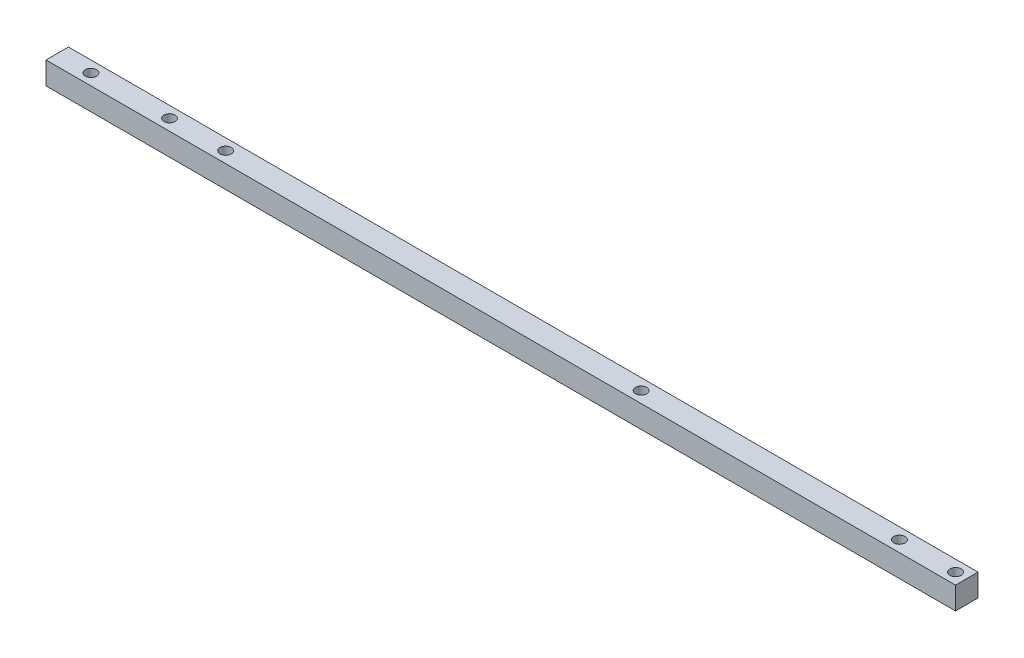
ISO-10303-21;
HEADER;
FILE_DESCRIPTION(('STEP AP214'),'2;1');
FILE_NAME('part.step','',(''),(''),'','','');
FILE_SCHEMA(('AUTOMOTIVE_DESIGN { 1 0 10303 214 1 1 1 1 }'));
ENDSEC;
DATA;
#1=APPLICATION_CONTEXT('core data for automotive mechanical design processes');
#2=APPLICATION_PROTOCOL_DEFINITION('international standard','automotive_design',2000,#1);
#3=PRODUCT_CONTEXT('',#1,'mechanical');
#4=PRODUCT('Part','Part','',(#3));
#5=PRODUCT_RELATED_PRODUCT_CATEGORY('part','',(#4));
#6=PRODUCT_DEFINITION_FORMATION('','',#4);
#7=PRODUCT_DEFINITION_CONTEXT('part definition',#1,'design');
#8=PRODUCT_DEFINITION('design','',#6,#7);
#9=PRODUCT_DEFINITION_SHAPE('','',#8);
#10=(LENGTH_UNIT() NAMED_UNIT(*) SI_UNIT(.MILLI.,.METRE.));
#11=(NAMED_UNIT(*) PLANE_ANGLE_UNIT() SI_UNIT($,.RADIAN.));
#12=(NAMED_UNIT(*) SI_UNIT($,.STERADIAN.) SOLID_ANGLE_UNIT());
#13=UNCERTAINTY_MEASURE_WITH_UNIT(LENGTH_MEASURE(1.E-05),#10,'distance_accuracy_value','');
#14=(GEOMETRIC_REPRESENTATION_CONTEXT(3) GLOBAL_UNCERTAINTY_ASSIGNED_CONTEXT((#13)) GLOBAL_UNIT_ASSIGNED_CONTEXT((#10,
#11,#12)) REPRESENTATION_CONTEXT('',''));
#15=CARTESIAN_POINT('',(0.,0.,0.));
#16=DIRECTION('',(0.,0.,1.));
#17=DIRECTION('',(1.,0.,0.));
#18=AXIS2_PLACEMENT_3D('',#15,#16,#17);
#19=CARTESIAN_POINT('',(0.,6.35,0.));
#20=DIRECTION('',(0.,-1.,0.));
#21=DIRECTION('',(0.,0.,-1.));
#22=AXIS2_PLACEMENT_3D('',#19,#20,#21);
#23=PLANE('',#22);
#24=DIRECTION('',(0.,0.,1.));
#25=VECTOR('',#24,1.);
#26=CARTESIAN_POINT('',(0.,6.35,0.));
#27=LINE('',#26,#25);
#28=CARTESIAN_POINT('',(0.,6.35,-6.35));
#29=VERTEX_POINT('',#28);
#30=CARTESIAN_POINT('',(0.,6.35,0.));
#31=VERTEX_POINT('',#30);
#32=EDGE_CURVE('E93',#29,#31,#27,.T.);
#33=ORIENTED_EDGE('',*,*,#32,.T.);
#34=DIRECTION('',(1.,0.,0.));
#35=VECTOR('',#34,1.);
#36=CARTESIAN_POINT('',(0.,6.35,0.));
#37=LINE('',#36,#35);
#38=CARTESIAN_POINT('',(257.175,6.35,0.));
#39=VERTEX_POINT('',#38);
#40=EDGE_CURVE('E88',#31,#39,#37,.T.);
#41=ORIENTED_EDGE('',*,*,#40,.T.);
#42=DIRECTION('',(0.,0.,-1.));
#43=VECTOR('',#42,1.);
#44=CARTESIAN_POINT('',(257.175,6.35,0.));
#45=LINE('',#44,#43);
#46=CARTESIAN_POINT('',(257.175,6.35,-6.35));
#47=VERTEX_POINT('',#46);
#48=EDGE_CURVE('E90',#39,#47,#45,.T.);
#49=ORIENTED_EDGE('',*,*,#48,.T.);
#50=DIRECTION('',(-1.,0.,0.));
#51=VECTOR('',#50,1.);
#52=CARTESIAN_POINT('',(0.,6.35,-6.35));
#53=LINE('',#52,#51);
#54=EDGE_CURVE('E57',#47,#29,#53,.T.);
#55=ORIENTED_EDGE('',*,*,#54,.T.);
#56=EDGE_LOOP('',(#33,#41,#49,#55));
#57=FACE_BOUND('',#56,.T.);
#58=CARTESIAN_POINT('',(31.75,6.35,-3.175));
#59=DIRECTION('',(0.,1.,0.));
#60=DIRECTION('',(0.,0.,1.));
#61=AXIS2_PLACEMENT_3D('',#58,#59,#60);
#62=CIRCLE('',#61,1.5875);
#63=CARTESIAN_POINT('',(31.75,6.35,-1.5875));
#64=VERTEX_POINT('',#63);
#65=EDGE_CURVE('E106',#64,#64,#62,.T.);
#66=ORIENTED_EDGE('',*,*,#65,.F.);
#67=EDGE_LOOP('',(#66));
#68=FACE_BOUND('',#67,.T.);
#69=CARTESIAN_POINT('',(165.1,6.35,-3.175));
#70=DIRECTION('',(0.,1.,0.));
#71=DIRECTION('',(0.,0.,1.));
#72=AXIS2_PLACEMENT_3D('',#69,#70,#71);
#73=CIRCLE('',#72,1.58749999999999);
#74=CARTESIAN_POINT('',(165.1,6.35,-1.58750000000001));
#75=VERTEX_POINT('',#74);
#76=EDGE_CURVE('E123',#75,#75,#73,.T.);
#77=ORIENTED_EDGE('',*,*,#76,.F.);
#78=EDGE_LOOP('',(#77));
#79=FACE_BOUND('',#78,.T.);
#80=CARTESIAN_POINT('',(238.125,6.35,-3.175));
#81=DIRECTION('',(0.,1.,0.));
#82=DIRECTION('',(0.,0.,1.));
#83=AXIS2_PLACEMENT_3D('',#80,#81,#82);
#84=CIRCLE('',#83,1.58749999999999);
#85=CARTESIAN_POINT('',(238.125,6.35,-1.58750000000001));
#86=VERTEX_POINT('',#85);
#87=EDGE_CURVE('E130',#86,#86,#84,.T.);
#88=ORIENTED_EDGE('',*,*,#87,.F.);
#89=EDGE_LOOP('',(#88));
#90=FACE_BOUND('',#89,.T.);
#91=CARTESIAN_POINT('',(9.525,6.35,-3.175));
#92=DIRECTION('',(0.,1.,0.));
#93=DIRECTION('',(0.,0.,1.));
#94=AXIS2_PLACEMENT_3D('',#91,#92,#93);
#95=CIRCLE('',#94,1.5875);
#96=CARTESIAN_POINT('',(9.525,6.35,-1.5875));
#97=VERTEX_POINT('',#96);
#98=EDGE_CURVE('E134',#97,#97,#95,.T.);
#99=ORIENTED_EDGE('',*,*,#98,.F.);
#100=EDGE_LOOP('',(#99));
#101=FACE_BOUND('',#100,.T.);
#102=CARTESIAN_POINT('',(47.625,6.35,-3.175));
#103=DIRECTION('',(0.,1.,0.));
#104=DIRECTION('',(0.,0.,1.));
#105=AXIS2_PLACEMENT_3D('',#102,#103,#104);
#106=CIRCLE('',#105,1.5875);
#107=CARTESIAN_POINT('',(47.625,6.35,-1.5875));
#108=VERTEX_POINT('',#107);
#109=EDGE_CURVE('E140',#108,#108,#106,.T.);
#110=ORIENTED_EDGE('',*,*,#109,.F.);
#111=EDGE_LOOP('',(#110));
#112=FACE_BOUND('',#111,.T.);
#113=CARTESIAN_POINT('',(254.,6.35,-3.175));
#114=DIRECTION('',(0.,1.,0.));
#115=DIRECTION('',(0.,0.,1.));
#116=AXIS2_PLACEMENT_3D('',#113,#114,#115);
#117=CIRCLE('',#116,1.58750000000004);
#118=CARTESIAN_POINT('',(254.,6.35,-1.58749999999996));
#119=VERTEX_POINT('',#118);
#120=EDGE_CURVE('E144',#119,#119,#117,.T.);
#121=ORIENTED_EDGE('',*,*,#120,.F.);
#122=EDGE_LOOP('',(#121));
#123=FACE_BOUND('',#122,.T.);
#124=ADVANCED_FACE('F39',(#57,#68,#79,#90,#101,#112,#123),#23,.F.);
#125=CARTESIAN_POINT('',(0.,0.,0.));
#126=DIRECTION('',(0.,-1.,0.));
#127=DIRECTION('',(0.,0.,-1.));
#128=AXIS2_PLACEMENT_3D('',#125,#126,#127);
#129=PLANE('',#128);
#130=CARTESIAN_POINT('',(47.625,0.,-3.175));
#131=DIRECTION('',(0.,1.,0.));
#132=DIRECTION('',(0.,0.,1.));
#133=AXIS2_PLACEMENT_3D('',#130,#131,#132);
#134=CIRCLE('',#133,1.5875);
#135=CARTESIAN_POINT('',(47.625,0.,-1.5875));
#136=VERTEX_POINT('',#135);
#137=EDGE_CURVE('E142',#136,#136,#134,.T.);
#138=ORIENTED_EDGE('',*,*,#137,.T.);
#139=EDGE_LOOP('',(#138));
#140=FACE_BOUND('',#139,.T.);
#141=CARTESIAN_POINT('',(238.125,0.,-3.175));
#142=DIRECTION('',(0.,1.,0.));
#143=DIRECTION('',(0.,0.,1.));
#144=AXIS2_PLACEMENT_3D('',#141,#142,#143);
#145=CIRCLE('',#144,1.58749999999999);
#146=CARTESIAN_POINT('',(238.125,0.,-1.58750000000001));
#147=VERTEX_POINT('',#146);
#148=EDGE_CURVE('E128',#147,#147,#145,.T.);
#149=ORIENTED_EDGE('',*,*,#148,.T.);
#150=EDGE_LOOP('',(#149));
#151=FACE_BOUND('',#150,.T.);
#152=CARTESIAN_POINT('',(31.75,0.,-3.175));
#153=DIRECTION('',(0.,1.,0.));
#154=DIRECTION('',(0.,0.,1.));
#155=AXIS2_PLACEMENT_3D('',#152,#153,#154);
#156=CIRCLE('',#155,1.5875);
#157=CARTESIAN_POINT('',(31.75,0.,-1.5875));
#158=VERTEX_POINT('',#157);
#159=EDGE_CURVE('E119',#158,#158,#156,.T.);
#160=ORIENTED_EDGE('',*,*,#159,.T.);
#161=EDGE_LOOP('',(#160));
#162=FACE_BOUND('',#161,.T.);
#163=DIRECTION('',(0.,0.,1.));
#164=VECTOR('',#163,1.);
#165=CARTESIAN_POINT('',(0.,0.,0.));
#166=LINE('',#165,#164);
#167=CARTESIAN_POINT('',(0.,0.,-6.35));
#168=VERTEX_POINT('',#167);
#169=CARTESIAN_POINT('',(0.,0.,0.));
#170=VERTEX_POINT('',#169);
#171=EDGE_CURVE('E103',#168,#170,#166,.T.);
#172=ORIENTED_EDGE('',*,*,#171,.F.);
#173=DIRECTION('',(-1.,0.,0.));
#174=VECTOR('',#173,1.);
#175=CARTESIAN_POINT('',(0.,0.,-6.35));
#176=LINE('',#175,#174);
#177=CARTESIAN_POINT('',(257.175,0.,-6.35));
#178=VERTEX_POINT('',#177);
#179=EDGE_CURVE('E76',#178,#168,#176,.T.);
#180=ORIENTED_EDGE('',*,*,#179,.F.);
#181=DIRECTION('',(0.,0.,-1.));
#182=VECTOR('',#181,1.);
#183=CARTESIAN_POINT('',(257.175,0.,0.));
#184=LINE('',#183,#182);
#185=CARTESIAN_POINT('',(257.175,0.,0.));
#186=VERTEX_POINT('',#185);
#187=EDGE_CURVE('E71',#186,#178,#184,.T.);
#188=ORIENTED_EDGE('',*,*,#187,.F.);
#189=DIRECTION('',(1.,0.,0.));
#190=VECTOR('',#189,1.);
#191=CARTESIAN_POINT('',(0.,0.,0.));
#192=LINE('',#191,#190);
#193=EDGE_CURVE('E92',#170,#186,#192,.T.);
#194=ORIENTED_EDGE('',*,*,#193,.F.);
#195=EDGE_LOOP('',(#172,#180,#188,#194));
#196=FACE_BOUND('',#195,.T.);
#197=CARTESIAN_POINT('',(165.1,0.,-3.175));
#198=DIRECTION('',(0.,1.,0.));
#199=DIRECTION('',(0.,0.,1.));
#200=AXIS2_PLACEMENT_3D('',#197,#198,#199);
#201=CIRCLE('',#200,1.58749999999999);
#202=CARTESIAN_POINT('',(165.1,0.,-1.58750000000001));
#203=VERTEX_POINT('',#202);
#204=EDGE_CURVE('E125',#203,#203,#201,.T.);
#205=ORIENTED_EDGE('',*,*,#204,.T.);
#206=EDGE_LOOP('',(#205));
#207=FACE_BOUND('',#206,.T.);
#208=CARTESIAN_POINT('',(9.525,0.,-3.175));
#209=DIRECTION('',(0.,1.,0.));
#210=DIRECTION('',(0.,0.,1.));
#211=AXIS2_PLACEMENT_3D('',#208,#209,#210);
#212=CIRCLE('',#211,1.5875);
#213=CARTESIAN_POINT('',(9.525,0.,-1.5875));
#214=VERTEX_POINT('',#213);
#215=EDGE_CURVE('E138',#214,#214,#212,.T.);
#216=ORIENTED_EDGE('',*,*,#215,.T.);
#217=EDGE_LOOP('',(#216));
#218=FACE_BOUND('',#217,.T.);
#219=CARTESIAN_POINT('',(254.,0.,-3.175));
#220=DIRECTION('',(0.,1.,0.));
#221=DIRECTION('',(0.,0.,1.));
#222=AXIS2_PLACEMENT_3D('',#219,#220,#221);
#223=CIRCLE('',#222,1.58750000000004);
#224=CARTESIAN_POINT('',(254.,0.,-1.58749999999996));
#225=VERTEX_POINT('',#224);
#226=EDGE_CURVE('E146',#225,#225,#223,.T.);
#227=ORIENTED_EDGE('',*,*,#226,.T.);
#228=EDGE_LOOP('',(#227));
#229=FACE_BOUND('',#228,.T.);
#230=ADVANCED_FACE('F111',(#140,#151,#162,#196,#207,#218,#229),#129,.T.);
#231=CARTESIAN_POINT('',(0.,6.35,0.));
#232=DIRECTION('',(1.,0.,0.));
#233=DIRECTION('',(0.,0.,-1.));
#234=AXIS2_PLACEMENT_3D('',#231,#232,#233);
#235=PLANE('',#234);
#236=ORIENTED_EDGE('',*,*,#171,.T.);
#237=DIRECTION('',(0.,-1.,0.));
#238=VECTOR('',#237,1.);
#239=CARTESIAN_POINT('',(0.,6.35,0.));
#240=LINE('',#239,#238);
#241=EDGE_CURVE('E11',#31,#170,#240,.T.);
#242=ORIENTED_EDGE('',*,*,#241,.F.);
#243=ORIENTED_EDGE('',*,*,#32,.F.);
#244=DIRECTION('',(0.,-1.,0.));
#245=VECTOR('',#244,1.);
#246=CARTESIAN_POINT('',(0.,6.35,-6.35));
#247=LINE('',#246,#245);
#248=EDGE_CURVE('E97',#29,#168,#247,.T.);
#249=ORIENTED_EDGE('',*,*,#248,.T.);
#250=EDGE_LOOP('',(#236,#242,#243,#249));
#251=FACE_BOUND('',#250,.T.);
#252=ADVANCED_FACE('F41',(#251),#235,.F.);
#253=CARTESIAN_POINT('',(0.,6.35,0.));
#254=DIRECTION('',(0.,0.,-1.));
#255=DIRECTION('',(-1.,0.,0.));
#256=AXIS2_PLACEMENT_3D('',#253,#254,#255);
#257=PLANE('',#256);
#258=ORIENTED_EDGE('',*,*,#193,.T.);
#259=DIRECTION('',(0.,-1.,0.));
#260=VECTOR('',#259,1.);
#261=CARTESIAN_POINT('',(257.175,6.35,0.));
#262=LINE('',#261,#260);
#263=EDGE_CURVE('E48',#39,#186,#262,.T.);
#264=ORIENTED_EDGE('',*,*,#263,.F.);
#265=ORIENTED_EDGE('',*,*,#40,.F.);
#266=ORIENTED_EDGE('',*,*,#241,.T.);
#267=EDGE_LOOP('',(#258,#264,#265,#266));
#268=FACE_BOUND('',#267,.T.);
#269=ADVANCED_FACE('F94',(#268),#257,.F.);
#270=CARTESIAN_POINT('',(257.175,6.35,0.));
#271=DIRECTION('',(-1.,0.,0.));
#272=DIRECTION('',(0.,0.,1.));
#273=AXIS2_PLACEMENT_3D('',#270,#271,#272);
#274=PLANE('',#273);
#275=ORIENTED_EDGE('',*,*,#187,.T.);
#276=DIRECTION('',(0.,-1.,0.));
#277=VECTOR('',#276,1.);
#278=CARTESIAN_POINT('',(257.175,6.35,-6.35));
#279=LINE('',#278,#277);
#280=EDGE_CURVE('E96',#47,#178,#279,.T.);
#281=ORIENTED_EDGE('',*,*,#280,.F.);
#282=ORIENTED_EDGE('',*,*,#48,.F.);
#283=ORIENTED_EDGE('',*,*,#263,.T.);
#284=EDGE_LOOP('',(#275,#281,#282,#283));
#285=FACE_BOUND('',#284,.T.);
#286=ADVANCED_FACE('F100',(#285),#274,.F.);
#287=CARTESIAN_POINT('',(0.,6.35,-6.35));
#288=DIRECTION('',(0.,0.,1.));
#289=DIRECTION('',(1.,0.,0.));
#290=AXIS2_PLACEMENT_3D('',#287,#288,#289);
#291=PLANE('',#290);
#292=ORIENTED_EDGE('',*,*,#179,.T.);
#293=ORIENTED_EDGE('',*,*,#248,.F.);
#294=ORIENTED_EDGE('',*,*,#54,.F.);
#295=ORIENTED_EDGE('',*,*,#280,.T.);
#296=EDGE_LOOP('',(#292,#293,#294,#295));
#297=FACE_BOUND('',#296,.T.);
#298=ADVANCED_FACE('F112',(#297),#291,.F.);
#299=CARTESIAN_POINT('',(31.75,6.35,-3.175));
#300=DIRECTION('',(0.,-1.,0.));
#301=DIRECTION('',(0.,0.,-1.));
#302=AXIS2_PLACEMENT_3D('',#299,#300,#301);
#303=CYLINDRICAL_SURFACE('',#302,1.5875);
#304=ORIENTED_EDGE('',*,*,#65,.T.);
#305=EDGE_LOOP('',(#304));
#306=FACE_BOUND('',#305,.T.);
#307=ORIENTED_EDGE('',*,*,#159,.F.);
#308=EDGE_LOOP('',(#307));
#309=FACE_BOUND('',#308,.T.);
#310=ADVANCED_FACE('F164',(#306,#309),#303,.F.);
#311=CARTESIAN_POINT('',(165.1,6.35,-3.175));
#312=DIRECTION('',(0.,-1.,0.));
#313=DIRECTION('',(0.,0.,-1.));
#314=AXIS2_PLACEMENT_3D('',#311,#312,#313);
#315=CYLINDRICAL_SURFACE('',#314,1.58749999999999);
#316=ORIENTED_EDGE('',*,*,#76,.T.);
#317=EDGE_LOOP('',(#316));
#318=FACE_BOUND('',#317,.T.);
#319=ORIENTED_EDGE('',*,*,#204,.F.);
#320=EDGE_LOOP('',(#319));
#321=FACE_BOUND('',#320,.T.);
#322=ADVANCED_FACE('F209',(#318,#321),#315,.F.);
#323=CARTESIAN_POINT('',(238.125,6.35,-3.175));
#324=DIRECTION('',(0.,-1.,0.));
#325=DIRECTION('',(0.,0.,-1.));
#326=AXIS2_PLACEMENT_3D('',#323,#324,#325);
#327=CYLINDRICAL_SURFACE('',#326,1.58749999999999);
#328=ORIENTED_EDGE('',*,*,#87,.T.);
#329=EDGE_LOOP('',(#328));
#330=FACE_BOUND('',#329,.T.);
#331=ORIENTED_EDGE('',*,*,#148,.F.);
#332=EDGE_LOOP('',(#331));
#333=FACE_BOUND('',#332,.T.);
#334=ADVANCED_FACE('F217',(#330,#333),#327,.F.);
#335=CARTESIAN_POINT('',(9.525,6.35,-3.175));
#336=DIRECTION('',(0.,-1.,0.));
#337=DIRECTION('',(0.,0.,-1.));
#338=AXIS2_PLACEMENT_3D('',#335,#336,#337);
#339=CYLINDRICAL_SURFACE('',#338,1.5875);
#340=ORIENTED_EDGE('',*,*,#98,.T.);
#341=EDGE_LOOP('',(#340));
#342=FACE_BOUND('',#341,.T.);
#343=ORIENTED_EDGE('',*,*,#215,.F.);
#344=EDGE_LOOP('',(#343));
#345=FACE_BOUND('',#344,.T.);
#346=ADVANCED_FACE('F227',(#342,#345),#339,.F.);
#347=CARTESIAN_POINT('',(47.625,6.35,-3.175));
#348=DIRECTION('',(0.,-1.,0.));
#349=DIRECTION('',(0.,0.,-1.));
#350=AXIS2_PLACEMENT_3D('',#347,#348,#349);
#351=CYLINDRICAL_SURFACE('',#350,1.5875);
#352=ORIENTED_EDGE('',*,*,#109,.T.);
#353=EDGE_LOOP('',(#352));
#354=FACE_BOUND('',#353,.T.);
#355=ORIENTED_EDGE('',*,*,#137,.F.);
#356=EDGE_LOOP('',(#355));
#357=FACE_BOUND('',#356,.T.);
#358=ADVANCED_FACE('F231',(#354,#357),#351,.F.);
#359=CARTESIAN_POINT('',(254.,6.35,-3.175));
#360=DIRECTION('',(0.,-1.,0.));
#361=DIRECTION('',(0.,0.,-1.));
#362=AXIS2_PLACEMENT_3D('',#359,#360,#361);
#363=CYLINDRICAL_SURFACE('',#362,1.58750000000004);
#364=ORIENTED_EDGE('',*,*,#120,.T.);
#365=EDGE_LOOP('',(#364));
#366=FACE_BOUND('',#365,.T.);
#367=ORIENTED_EDGE('',*,*,#226,.F.);
#368=EDGE_LOOP('',(#367));
#369=FACE_BOUND('',#368,.T.);
#370=ADVANCED_FACE('F152',(#366,#369),#363,.F.);
#371=CLOSED_SHELL('',(#124,#230,#252,#269,#286,#298,#310,#322,#334,#346,#358,#370));
#372=MANIFOLD_SOLID_BREP('B2',#371);
#373=ADVANCED_BREP_SHAPE_REPRESENTATION('',(#18,#372),#14);
#374=SHAPE_DEFINITION_REPRESENTATION(#9,#373);
ENDSEC;
END-ISO-10303-21;
